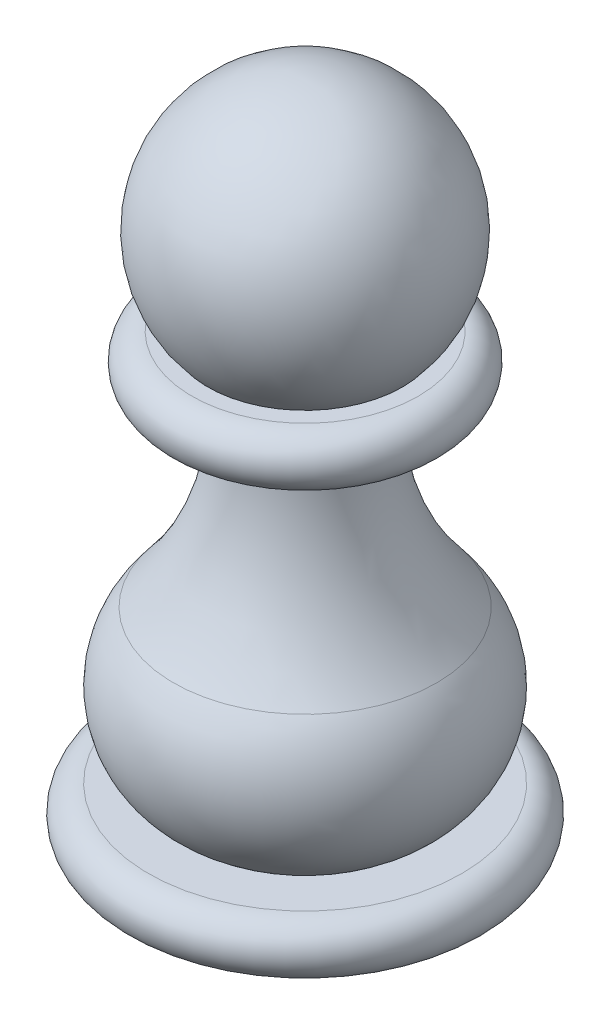
ISO-10303-21;
HEADER;
FILE_DESCRIPTION(('STEP AP214'),'2;1');
FILE_NAME('part.step','',(''),(''),'','','');
FILE_SCHEMA(('AUTOMOTIVE_DESIGN { 1 0 10303 214 1 1 1 1 }'));
ENDSEC;
DATA;
#1=APPLICATION_CONTEXT('core data for automotive mechanical design processes');
#2=APPLICATION_PROTOCOL_DEFINITION('international standard','automotive_design',2000,#1);
#3=PRODUCT_CONTEXT('',#1,'mechanical');
#4=PRODUCT('Part','Part','',(#3));
#5=PRODUCT_RELATED_PRODUCT_CATEGORY('part','',(#4));
#6=PRODUCT_DEFINITION_FORMATION('','',#4);
#7=PRODUCT_DEFINITION_CONTEXT('part definition',#1,'design');
#8=PRODUCT_DEFINITION('design','',#6,#7);
#9=PRODUCT_DEFINITION_SHAPE('','',#8);
#10=(LENGTH_UNIT() NAMED_UNIT(*) SI_UNIT(.MILLI.,.METRE.));
#11=(NAMED_UNIT(*) PLANE_ANGLE_UNIT() SI_UNIT($,.RADIAN.));
#12=(NAMED_UNIT(*) SI_UNIT($,.STERADIAN.) SOLID_ANGLE_UNIT());
#13=UNCERTAINTY_MEASURE_WITH_UNIT(LENGTH_MEASURE(1.E-05),#10,'distance_accuracy_value','');
#14=(GEOMETRIC_REPRESENTATION_CONTEXT(3) GLOBAL_UNCERTAINTY_ASSIGNED_CONTEXT((#13)) GLOBAL_UNIT_ASSIGNED_CONTEXT((#10,
#11,#12)) REPRESENTATION_CONTEXT('',''));
#15=CARTESIAN_POINT('',(0.,0.,0.));
#16=DIRECTION('',(0.,0.,1.));
#17=DIRECTION('',(1.,0.,0.));
#18=AXIS2_PLACEMENT_3D('',#15,#16,#17);
#19=CARTESIAN_POINT('',(0.,-7.5,0.));
#20=DIRECTION('',(0.,-1.,0.));
#21=DIRECTION('',(1.,0.,0.));
#22=AXIS2_PLACEMENT_3D('',#19,#20,#21);
#23=SPHERICAL_SURFACE('',#22,7.5);
#24=CARTESIAN_POINT('',(0.,-12.5,0.));
#25=DIRECTION('',(0.,-1.,0.));
#26=DIRECTION('',(1.,0.,0.));
#27=AXIS2_PLACEMENT_3D('',#24,#25,#26);
#28=CIRCLE('',#27,5.59016994374947);
#29=CARTESIAN_POINT('',(5.59016994374947,-12.5,0.));
#30=VERTEX_POINT('',#29);
#31=EDGE_CURVE('E10',#30,#30,#28,.T.);
#32=ORIENTED_EDGE('',*,*,#31,.F.);
#33=EDGE_LOOP('',(#32));
#34=FACE_BOUND('',#33,.T.);
#35=ADVANCED_FACE('F43',(#34),#23,.T.);
#36=CARTESIAN_POINT('',(5.59016994374947,-12.5,0.));
#37=DIRECTION('',(0.,1.,0.));
#38=DIRECTION('',(-1.,0.,0.));
#39=AXIS2_PLACEMENT_3D('',#36,#37,#38);
#40=PLANE('',#39);
#41=ORIENTED_EDGE('',*,*,#31,.T.);
#42=EDGE_LOOP('',(#41));
#43=FACE_BOUND('',#42,.T.);
#44=CARTESIAN_POINT('',(0.,-12.5,0.));
#45=DIRECTION('',(0.,-1.,0.));
#46=DIRECTION('',(1.,0.,0.));
#47=AXIS2_PLACEMENT_3D('',#44,#45,#46);
#48=CIRCLE('',#47,6.5);
#49=CARTESIAN_POINT('',(6.5,-12.5,0.));
#50=VERTEX_POINT('',#49);
#51=EDGE_CURVE('E49',#50,#50,#48,.T.);
#52=ORIENTED_EDGE('',*,*,#51,.F.);
#53=EDGE_LOOP('',(#52));
#54=FACE_BOUND('',#53,.T.);
#55=ADVANCED_FACE('F97',(#43,#54),#40,.T.);
#56=CARTESIAN_POINT('',(0.,-14.,0.));
#57=DIRECTION('',(0.,-1.,0.));
#58=DIRECTION('',(1.,0.,0.));
#59=AXIS2_PLACEMENT_3D('',#56,#57,#58);
#60=TOROIDAL_SURFACE('',#59,6.5,1.5);
#61=ORIENTED_EDGE('',*,*,#51,.T.);
#62=EDGE_LOOP('',(#61));
#63=FACE_BOUND('',#62,.T.);
#64=CARTESIAN_POINT('',(0.,-15.5,0.));
#65=DIRECTION('',(0.,-1.,0.));
#66=DIRECTION('',(1.,0.,0.));
#67=AXIS2_PLACEMENT_3D('',#64,#65,#66);
#68=CIRCLE('',#67,6.5);
#69=CARTESIAN_POINT('',(6.5,-15.5,0.));
#70=VERTEX_POINT('',#69);
#71=EDGE_CURVE('E54',#70,#70,#68,.T.);
#72=ORIENTED_EDGE('',*,*,#71,.F.);
#73=EDGE_LOOP('',(#72));
#74=FACE_BOUND('',#73,.T.);
#75=ADVANCED_FACE('F102',(#63,#74),#60,.T.);
#76=CARTESIAN_POINT('',(4.,-15.5,0.));
#77=DIRECTION('',(0.,-1.,0.));
#78=DIRECTION('',(1.,0.,0.));
#79=AXIS2_PLACEMENT_3D('',#76,#77,#78);
#80=PLANE('',#79);
#81=ORIENTED_EDGE('',*,*,#71,.T.);
#82=EDGE_LOOP('',(#81));
#83=FACE_BOUND('',#82,.T.);
#84=CARTESIAN_POINT('',(0.,-15.5,0.));
#85=DIRECTION('',(0.,-1.,0.));
#86=DIRECTION('',(1.,0.,0.));
#87=AXIS2_PLACEMENT_3D('',#84,#85,#86);
#88=CIRCLE('',#87,4.);
#89=CARTESIAN_POINT('',(4.,-15.5,0.));
#90=VERTEX_POINT('',#89);
#91=EDGE_CURVE('E58',#90,#90,#88,.T.);
#92=ORIENTED_EDGE('',*,*,#91,.F.);
#93=EDGE_LOOP('',(#92));
#94=FACE_BOUND('',#93,.T.);
#95=ADVANCED_FACE('F107',(#83,#94),#80,.T.);
#96=CARTESIAN_POINT('',(0.,-16.4869857494152,0.));
#97=DIRECTION('',(0.,-1.,0.));
#98=DIRECTION('',(1.,0.,0.));
#99=AXIS2_PLACEMENT_3D('',#96,#97,#98);
#100=TOROIDAL_SURFACE('',#99,18.9674934150796,15.);
#101=ORIENTED_EDGE('',*,*,#91,.T.);
#102=EDGE_LOOP('',(#101));
#103=FACE_BOUND('',#102,.T.);
#104=CARTESIAN_POINT('',(0.,-26.2295693766868,0.));
#105=DIRECTION('',(0.,-1.,0.));
#106=DIRECTION('',(1.,0.,0.));
#107=AXIS2_PLACEMENT_3D('',#104,#105,#106);
#108=CIRCLE('',#107,7.56214097573703);
#109=CARTESIAN_POINT('',(7.56214097573703,-26.2295693766868,0.));
#110=VERTEX_POINT('',#109);
#111=EDGE_CURVE('E66',#110,#110,#108,.T.);
#112=ORIENTED_EDGE('',*,*,#111,.F.);
#113=EDGE_LOOP('',(#112));
#114=FACE_BOUND('',#113,.T.);
#115=ADVANCED_FACE('F111',(#103,#114),#100,.F.);
#116=CARTESIAN_POINT('',(0.,-30.1266028275955,0.));
#117=DIRECTION('',(0.,-1.,0.));
#118=DIRECTION('',(1.,0.,0.));
#119=AXIS2_PLACEMENT_3D('',#116,#117,#118);
#120=DEGENERATE_TOROIDAL_SURFACE('',#119,3.,6.,.T.);
#121=ORIENTED_EDGE('',*,*,#111,.T.);
#122=EDGE_LOOP('',(#121));
#123=FACE_BOUND('',#122,.T.);
#124=CARTESIAN_POINT('',(0.,-35.,0.));
#125=DIRECTION('',(0.,-1.,0.));
#126=DIRECTION('',(1.,0.,0.));
#127=AXIS2_PLACEMENT_3D('',#124,#125,#126);
#128=CIRCLE('',#127,6.5);
#129=CARTESIAN_POINT('',(6.5,-35.,0.));
#130=VERTEX_POINT('',#129);
#131=EDGE_CURVE('E69',#130,#130,#128,.T.);
#132=ORIENTED_EDGE('',*,*,#131,.F.);
#133=EDGE_LOOP('',(#132));
#134=FACE_BOUND('',#133,.T.);
#135=ADVANCED_FACE('F92',(#123,#134),#120,.T.);
#136=CARTESIAN_POINT('',(6.5,-35.,0.));
#137=DIRECTION('',(0.,1.,0.));
#138=DIRECTION('',(-1.,0.,0.));
#139=AXIS2_PLACEMENT_3D('',#136,#137,#138);
#140=PLANE('',#139);
#141=ORIENTED_EDGE('',*,*,#131,.T.);
#142=EDGE_LOOP('',(#141));
#143=FACE_BOUND('',#142,.T.);
#144=CARTESIAN_POINT('',(0.,-35.,0.));
#145=DIRECTION('',(0.,-1.,0.));
#146=DIRECTION('',(1.,0.,0.));
#147=AXIS2_PLACEMENT_3D('',#144,#145,#146);
#148=CIRCLE('',#147,9.);
#149=CARTESIAN_POINT('',(9.,-35.,0.));
#150=VERTEX_POINT('',#149);
#151=EDGE_CURVE('E74',#150,#150,#148,.T.);
#152=ORIENTED_EDGE('',*,*,#151,.F.);
#153=EDGE_LOOP('',(#152));
#154=FACE_BOUND('',#153,.T.);
#155=ADVANCED_FACE('F87',(#143,#154),#140,.T.);
#156=CARTESIAN_POINT('',(0.,-36.5,0.));
#157=DIRECTION('',(0.,-1.,0.));
#158=DIRECTION('',(1.,0.,0.));
#159=AXIS2_PLACEMENT_3D('',#156,#157,#158);
#160=TOROIDAL_SURFACE('',#159,9.,1.5);
#161=ORIENTED_EDGE('',*,*,#151,.T.);
#162=EDGE_LOOP('',(#161));
#163=FACE_BOUND('',#162,.T.);
#164=CARTESIAN_POINT('',(0.,-38.,0.));
#165=DIRECTION('',(0.,-1.,0.));
#166=DIRECTION('',(1.,0.,0.));
#167=AXIS2_PLACEMENT_3D('',#164,#165,#166);
#168=CIRCLE('',#167,9.);
#169=CARTESIAN_POINT('',(9.,-38.,0.));
#170=VERTEX_POINT('',#169);
#171=EDGE_CURVE('E79',#170,#170,#168,.T.);
#172=ORIENTED_EDGE('',*,*,#171,.F.);
#173=EDGE_LOOP('',(#172));
#174=FACE_BOUND('',#173,.T.);
#175=ADVANCED_FACE('F84',(#163,#174),#160,.T.);
#176=CARTESIAN_POINT('',(0.,-38.,0.));
#177=DIRECTION('',(0.,-1.,0.));
#178=DIRECTION('',(1.,0.,0.));
#179=AXIS2_PLACEMENT_3D('',#176,#177,#178);
#180=PLANE('',#179);
#181=ORIENTED_EDGE('',*,*,#171,.T.);
#182=EDGE_LOOP('',(#181));
#183=FACE_BOUND('',#182,.T.);
#184=ADVANCED_FACE('F83',(#183),#180,.T.);
#185=CLOSED_SHELL('',(#35,#55,#75,#95,#115,#135,#155,#175,#184));
#186=MANIFOLD_SOLID_BREP('B2',#185);
#187=ADVANCED_BREP_SHAPE_REPRESENTATION('',(#18,#186),#14);
#188=SHAPE_DEFINITION_REPRESENTATION(#9,#187);
ENDSEC;
END-ISO-10303-21;
